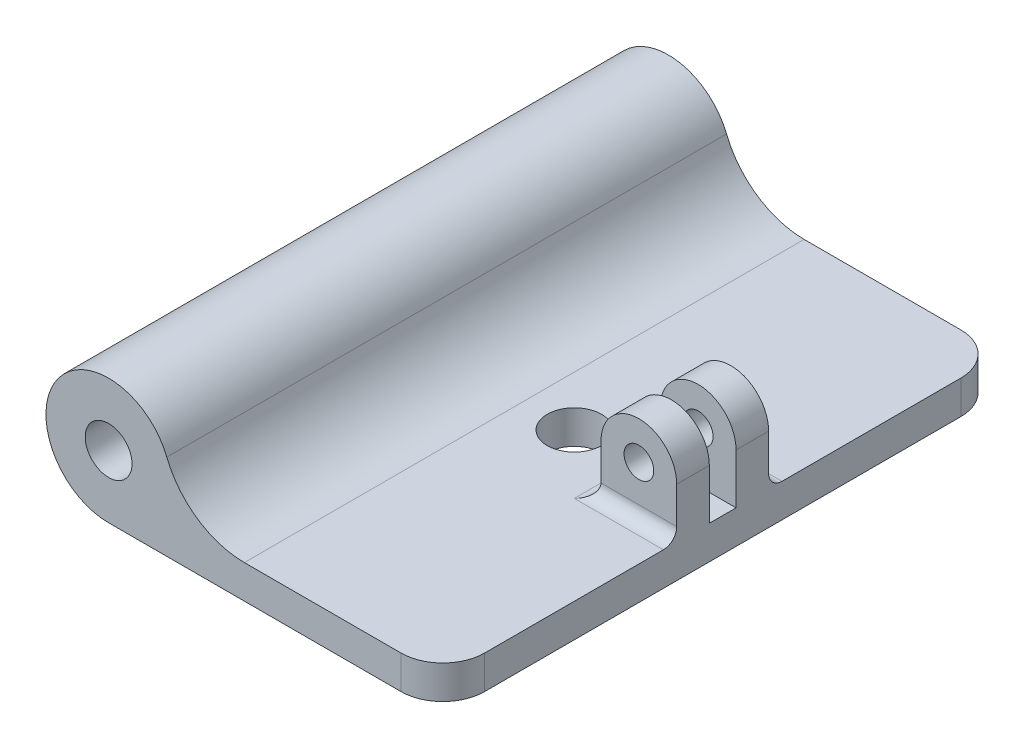
ISO-10303-21;
HEADER;
FILE_DESCRIPTION(('STEP AP214'),'2;1');
FILE_NAME('part.step','',(''),(''),'','','');
FILE_SCHEMA(('AUTOMOTIVE_DESIGN { 1 0 10303 214 1 1 1 1 }'));
ENDSEC;
DATA;
#1=APPLICATION_CONTEXT('core data for automotive mechanical design processes');
#2=APPLICATION_PROTOCOL_DEFINITION('international standard','automotive_design',2000,#1);
#3=PRODUCT_CONTEXT('',#1,'mechanical');
#4=PRODUCT('Part','Part','',(#3));
#5=PRODUCT_RELATED_PRODUCT_CATEGORY('part','',(#4));
#6=PRODUCT_DEFINITION_FORMATION('','',#4);
#7=PRODUCT_DEFINITION_CONTEXT('part definition',#1,'design');
#8=PRODUCT_DEFINITION('design','',#6,#7);
#9=PRODUCT_DEFINITION_SHAPE('','',#8);
#10=(LENGTH_UNIT() NAMED_UNIT(*) SI_UNIT(.MILLI.,.METRE.));
#11=(NAMED_UNIT(*) PLANE_ANGLE_UNIT() SI_UNIT($,.RADIAN.));
#12=(NAMED_UNIT(*) SI_UNIT($,.STERADIAN.) SOLID_ANGLE_UNIT());
#13=UNCERTAINTY_MEASURE_WITH_UNIT(LENGTH_MEASURE(1.E-05),#10,'distance_accuracy_value','');
#14=(GEOMETRIC_REPRESENTATION_CONTEXT(3) GLOBAL_UNCERTAINTY_ASSIGNED_CONTEXT((#13)) GLOBAL_UNIT_ASSIGNED_CONTEXT((#10,
#11,#12)) REPRESENTATION_CONTEXT('',''));
#15=CARTESIAN_POINT('',(0.,0.,0.));
#16=DIRECTION('',(0.,0.,1.));
#17=DIRECTION('',(1.,0.,0.));
#18=AXIS2_PLACEMENT_3D('',#15,#16,#17);
#19=CARTESIAN_POINT('',(40.,-3.5,67.));
#20=DIRECTION('',(-1.,0.,0.));
#21=DIRECTION('',(0.,-1.,0.));
#22=AXIS2_PLACEMENT_3D('',#19,#20,#21);
#23=PLANE('',#22);
#24=DIRECTION('',(0.,0.,-1.));
#25=VECTOR('',#24,1.);
#26=CARTESIAN_POINT('',(40.,-7.5,67.));
#27=LINE('',#26,#25);
#28=CARTESIAN_POINT('',(40.,-7.5,62.));
#29=VERTEX_POINT('',#28);
#30=CARTESIAN_POINT('',(40.,-7.5,5.));
#31=VERTEX_POINT('',#30);
#32=EDGE_CURVE('E235',#29,#31,#27,.T.);
#33=ORIENTED_EDGE('',*,*,#32,.T.);
#34=DIRECTION('',(0.,1.,0.));
#35=VECTOR('',#34,1.);
#36=CARTESIAN_POINT('',(40.,-3.5,5.));
#37=LINE('',#36,#35);
#38=CARTESIAN_POINT('',(40.,-3.5,5.));
#39=VERTEX_POINT('',#38);
#40=EDGE_CURVE('E278',#31,#39,#37,.T.);
#41=ORIENTED_EDGE('',*,*,#40,.T.);
#42=DIRECTION('',(0.,0.,-1.));
#43=VECTOR('',#42,1.);
#44=CARTESIAN_POINT('',(40.,-3.5,67.));
#45=LINE('',#44,#43);
#46=CARTESIAN_POINT('',(40.,-3.5,26.4));
#47=VERTEX_POINT('',#46);
#48=EDGE_CURVE('E232',#47,#39,#45,.T.);
#49=ORIENTED_EDGE('',*,*,#48,.F.);
#50=CARTESIAN_POINT('',(40.,-1.9,26.4));
#51=DIRECTION('',(-1.,0.,0.));
#52=DIRECTION('',(0.,-1.,0.));
#53=AXIS2_PLACEMENT_3D('',#50,#51,#52);
#54=CIRCLE('',#53,1.6);
#55=CARTESIAN_POINT('',(40.,-1.9,28.));
#56=VERTEX_POINT('',#55);
#57=EDGE_CURVE('E261',#47,#56,#54,.T.);
#58=ORIENTED_EDGE('',*,*,#57,.T.);
#59=DIRECTION('',(0.,1.,0.));
#60=VECTOR('',#59,1.);
#61=CARTESIAN_POINT('',(40.,0.,28.));
#62=LINE('',#61,#60);
#63=CARTESIAN_POINT('',(40.,2.5,28.));
#64=VERTEX_POINT('',#63);
#65=EDGE_CURVE('E190',#56,#64,#62,.T.);
#66=ORIENTED_EDGE('',*,*,#65,.T.);
#67=DIRECTION('',(0.,0.,-1.));
#68=VECTOR('',#67,1.);
#69=CARTESIAN_POINT('',(40.,2.5,39.));
#70=LINE('',#69,#68);
#71=CARTESIAN_POINT('',(40.,2.5,31.9));
#72=VERTEX_POINT('',#71);
#73=EDGE_CURVE('E182',#72,#64,#70,.T.);
#74=ORIENTED_EDGE('',*,*,#73,.F.);
#75=DIRECTION('',(0.,1.,0.));
#76=VECTOR('',#75,1.);
#77=CARTESIAN_POINT('',(40.,0.,31.9));
#78=LINE('',#77,#76);
#79=CARTESIAN_POINT('',(40.,-3.5,31.9));
#80=VERTEX_POINT('',#79);
#81=EDGE_CURVE('E165',#80,#72,#78,.T.);
#82=ORIENTED_EDGE('',*,*,#81,.F.);
#83=DIRECTION('',(0.,0.,1.));
#84=VECTOR('',#83,1.);
#85=CARTESIAN_POINT('',(40.,-3.5,31.9));
#86=LINE('',#85,#84);
#87=CARTESIAN_POINT('',(40.,-3.5,35.1));
#88=VERTEX_POINT('',#87);
#89=EDGE_CURVE('E378',#80,#88,#86,.T.);
#90=ORIENTED_EDGE('',*,*,#89,.T.);
#91=DIRECTION('',(0.,1.,0.));
#92=VECTOR('',#91,1.);
#93=CARTESIAN_POINT('',(40.,0.,35.1));
#94=LINE('',#93,#92);
#95=CARTESIAN_POINT('',(40.,2.5,35.1));
#96=VERTEX_POINT('',#95);
#97=EDGE_CURVE('E393',#88,#96,#94,.T.);
#98=ORIENTED_EDGE('',*,*,#97,.T.);
#99=CARTESIAN_POINT('',(40.,2.5,39.));
#100=VERTEX_POINT('',#99);
#101=EDGE_CURVE('E191',#100,#96,#70,.T.);
#102=ORIENTED_EDGE('',*,*,#101,.F.);
#103=DIRECTION('',(0.,1.,0.));
#104=VECTOR('',#103,1.);
#105=CARTESIAN_POINT('',(40.,0.,39.));
#106=LINE('',#105,#104);
#107=CARTESIAN_POINT('',(40.,-1.9,39.));
#108=VERTEX_POINT('',#107);
#109=EDGE_CURVE('E359',#108,#100,#106,.T.);
#110=ORIENTED_EDGE('',*,*,#109,.F.);
#111=CARTESIAN_POINT('',(40.,-1.9,40.6));
#112=DIRECTION('',(-1.,0.,0.));
#113=DIRECTION('',(0.,-1.,0.));
#114=AXIS2_PLACEMENT_3D('',#111,#112,#113);
#115=CIRCLE('',#114,1.6);
#116=CARTESIAN_POINT('',(40.,-3.5,40.6));
#117=VERTEX_POINT('',#116);
#118=EDGE_CURVE('E267',#108,#117,#115,.T.);
#119=ORIENTED_EDGE('',*,*,#118,.T.);
#120=CARTESIAN_POINT('',(40.,-3.5,62.));
#121=VERTEX_POINT('',#120);
#122=EDGE_CURVE('E233',#121,#117,#45,.T.);
#123=ORIENTED_EDGE('',*,*,#122,.F.);
#124=DIRECTION('',(0.,1.,0.));
#125=VECTOR('',#124,1.);
#126=CARTESIAN_POINT('',(40.,-7.5,62.));
#127=LINE('',#126,#125);
#128=EDGE_CURVE('E270',#121,#29,#127,.F.);
#129=ORIENTED_EDGE('',*,*,#128,.T.);
#130=EDGE_LOOP('',(#33,#41,#49,#58,#66,#74,#82,#90,#98,#102,#110,#119,#123,#129));
#131=FACE_BOUND('',#130,.T.);
#132=ADVANCED_FACE('F35',(#131),#23,.F.);
#133=CARTESIAN_POINT('',(35.47,2.5,39.));
#134=DIRECTION('',(0.,0.,-1.));
#135=DIRECTION('',(-1.,0.,0.));
#136=AXIS2_PLACEMENT_3D('',#133,#134,#135);
#137=CYLINDRICAL_SURFACE('',#136,4.53);
#138=CARTESIAN_POINT('',(35.47,2.5,31.9));
#139=DIRECTION('',(0.,0.,1.));
#140=DIRECTION('',(1.,0.,0.));
#141=AXIS2_PLACEMENT_3D('',#138,#139,#140);
#142=CIRCLE('',#141,4.53);
#143=CARTESIAN_POINT('',(30.94,2.5,31.9));
#144=VERTEX_POINT('',#143);
#145=EDGE_CURVE('E169',#72,#144,#142,.T.);
#146=ORIENTED_EDGE('',*,*,#145,.F.);
#147=ORIENTED_EDGE('',*,*,#73,.T.);
#148=CARTESIAN_POINT('',(35.47,2.5,28.));
#149=DIRECTION('',(0.,0.,1.));
#150=DIRECTION('',(1.,0.,0.));
#151=AXIS2_PLACEMENT_3D('',#148,#149,#150);
#152=CIRCLE('',#151,4.53);
#153=CARTESIAN_POINT('',(30.94,2.5,28.));
#154=VERTEX_POINT('',#153);
#155=EDGE_CURVE('E380',#64,#154,#152,.T.);
#156=ORIENTED_EDGE('',*,*,#155,.T.);
#157=DIRECTION('',(0.,0.,-1.));
#158=VECTOR('',#157,1.);
#159=CARTESIAN_POINT('',(30.94,2.5,39.));
#160=LINE('',#159,#158);
#161=EDGE_CURVE('E185',#144,#154,#160,.T.);
#162=ORIENTED_EDGE('',*,*,#161,.F.);
#163=EDGE_LOOP('',(#146,#147,#156,#162));
#164=FACE_BOUND('',#163,.T.);
#165=ADVANCED_FACE('F180',(#164),#137,.T.);
#166=CARTESIAN_POINT('',(30.94,0.,39.));
#167=DIRECTION('',(-1.,0.,0.));
#168=DIRECTION('',(0.,0.,1.));
#169=AXIS2_PLACEMENT_3D('',#166,#167,#168);
#170=PLANE('',#169);
#171=DIRECTION('',(0.,1.,0.));
#172=VECTOR('',#171,1.);
#173=CARTESIAN_POINT('',(30.94,0.,28.));
#174=LINE('',#173,#172);
#175=CARTESIAN_POINT('',(30.94,-1.9,28.));
#176=VERTEX_POINT('',#175);
#177=EDGE_CURVE('E370',#176,#154,#174,.T.);
#178=ORIENTED_EDGE('',*,*,#177,.F.);
#179=DIRECTION('',(0.,0.,-1.));
#180=VECTOR('',#179,1.);
#181=CARTESIAN_POINT('',(30.94,-1.9,39.));
#182=LINE('',#181,#180);
#183=CARTESIAN_POINT('',(30.94,-1.9,31.9));
#184=VERTEX_POINT('',#183);
#185=EDGE_CURVE('E255',#176,#184,#182,.F.);
#186=ORIENTED_EDGE('',*,*,#185,.T.);
#187=DIRECTION('',(0.,1.,0.));
#188=VECTOR('',#187,1.);
#189=CARTESIAN_POINT('',(30.94,0.,31.9));
#190=LINE('',#189,#188);
#191=EDGE_CURVE('E186',#184,#144,#190,.T.);
#192=ORIENTED_EDGE('',*,*,#191,.T.);
#193=ORIENTED_EDGE('',*,*,#161,.T.);
#194=EDGE_LOOP('',(#178,#186,#192,#193));
#195=FACE_BOUND('',#194,.T.);
#196=ADVANCED_FACE('F321',(#195),#170,.T.);
#197=CARTESIAN_POINT('',(35.47,2.5,39.));
#198=DIRECTION('',(0.,0.,-1.));
#199=DIRECTION('',(-1.,0.,0.));
#200=AXIS2_PLACEMENT_3D('',#197,#198,#199);
#201=CYLINDRICAL_SURFACE('',#200,1.778);
#202=CARTESIAN_POINT('',(35.47,2.5,28.));
#203=DIRECTION('',(0.,0.,1.));
#204=DIRECTION('',(1.,0.,0.));
#205=AXIS2_PLACEMENT_3D('',#202,#203,#204);
#206=CIRCLE('',#205,1.778);
#207=CARTESIAN_POINT('',(37.248,2.5,28.));
#208=VERTEX_POINT('',#207);
#209=EDGE_CURVE('E375',#208,#208,#206,.T.);
#210=ORIENTED_EDGE('',*,*,#209,.F.);
#211=EDGE_LOOP('',(#210));
#212=FACE_BOUND('',#211,.T.);
#213=CARTESIAN_POINT('',(35.47,2.5,31.9));
#214=DIRECTION('',(0.,0.,1.));
#215=DIRECTION('',(1.,0.,0.));
#216=AXIS2_PLACEMENT_3D('',#213,#214,#215);
#217=CIRCLE('',#216,1.778);
#218=CARTESIAN_POINT('',(37.248,2.5,31.9));
#219=VERTEX_POINT('',#218);
#220=EDGE_CURVE('E176',#219,#219,#217,.T.);
#221=ORIENTED_EDGE('',*,*,#220,.T.);
#222=EDGE_LOOP('',(#221));
#223=FACE_BOUND('',#222,.T.);
#224=ADVANCED_FACE('F425',(#212,#223),#201,.F.);
#225=CARTESIAN_POINT('',(16.2480768092719,6.5,67.));
#226=DIRECTION('',(0.,0.,1.));
#227=DIRECTION('',(1.,0.,0.));
#228=AXIS2_PLACEMENT_3D('',#225,#226,#227);
#229=PLANE('',#228);
#230=DIRECTION('',(1.,0.,0.));
#231=VECTOR('',#230,1.);
#232=CARTESIAN_POINT('',(0.,-7.5,67.));
#233=LINE('',#232,#231);
#234=CARTESIAN_POINT('',(0.,-7.5,67.));
#235=VERTEX_POINT('',#234);
#236=CARTESIAN_POINT('',(35.,-7.5,67.));
#237=VERTEX_POINT('',#236);
#238=EDGE_CURVE('E218',#235,#237,#233,.T.);
#239=ORIENTED_EDGE('',*,*,#238,.T.);
#240=DIRECTION('',(0.,1.,0.));
#241=VECTOR('',#240,1.);
#242=CARTESIAN_POINT('',(35.,-3.50000000000001,67.));
#243=LINE('',#242,#241);
#244=CARTESIAN_POINT('',(35.,-3.5,67.));
#245=VERTEX_POINT('',#244);
#246=EDGE_CURVE('E11',#237,#245,#243,.T.);
#247=ORIENTED_EDGE('',*,*,#246,.T.);
#248=DIRECTION('',(-1.,0.,0.));
#249=VECTOR('',#248,1.);
#250=CARTESIAN_POINT('',(16.2480768092719,-3.5,67.));
#251=LINE('',#250,#249);
#252=CARTESIAN_POINT('',(16.2480768092719,-3.5,67.));
#253=VERTEX_POINT('',#252);
#254=EDGE_CURVE('E220',#245,#253,#251,.T.);
#255=ORIENTED_EDGE('',*,*,#254,.T.);
#256=CARTESIAN_POINT('',(16.2480768092719,6.5,67.));
#257=DIRECTION('',(0.,0.,-1.));
#258=DIRECTION('',(1.,0.,0.));
#259=AXIS2_PLACEMENT_3D('',#256,#257,#258);
#260=CIRCLE('',#259,10.);
#261=CARTESIAN_POINT('',(6.96346148968797,2.78571428571429,67.));
#262=VERTEX_POINT('',#261);
#263=EDGE_CURVE('E212',#253,#262,#260,.T.);
#264=ORIENTED_EDGE('',*,*,#263,.T.);
#265=CARTESIAN_POINT('',(0.,0.,67.));
#266=DIRECTION('',(0.,0.,1.));
#267=DIRECTION('',(1.,0.,0.));
#268=AXIS2_PLACEMENT_3D('',#265,#266,#267);
#269=CIRCLE('',#268,7.5);
#270=EDGE_CURVE('E215',#262,#235,#269,.T.);
#271=ORIENTED_EDGE('',*,*,#270,.T.);
#272=EDGE_LOOP('',(#239,#247,#255,#264,#271));
#273=FACE_BOUND('',#272,.T.);
#274=CARTESIAN_POINT('',(0.,0.,67.));
#275=DIRECTION('',(0.,0.,1.));
#276=DIRECTION('',(1.,0.,0.));
#277=AXIS2_PLACEMENT_3D('',#274,#275,#276);
#278=CIRCLE('',#277,2.8);
#279=CARTESIAN_POINT('',(2.8,0.,67.));
#280=VERTEX_POINT('',#279);
#281=EDGE_CURVE('E206',#280,#280,#278,.T.);
#282=ORIENTED_EDGE('',*,*,#281,.F.);
#283=EDGE_LOOP('',(#282));
#284=FACE_BOUND('',#283,.T.);
#285=ADVANCED_FACE('F307',(#273,#284),#229,.T.);
#286=CARTESIAN_POINT('',(16.2480768092719,6.5,0.));
#287=DIRECTION('',(0.,0.,1.));
#288=DIRECTION('',(1.,0.,0.));
#289=AXIS2_PLACEMENT_3D('',#286,#287,#288);
#290=PLANE('',#289);
#291=DIRECTION('',(-1.,0.,0.));
#292=VECTOR('',#291,1.);
#293=CARTESIAN_POINT('',(16.2480768092719,-3.5,0.));
#294=LINE('',#293,#292);
#295=CARTESIAN_POINT('',(35.,-3.5,0.));
#296=VERTEX_POINT('',#295);
#297=CARTESIAN_POINT('',(16.2480768092719,-3.5,0.));
#298=VERTEX_POINT('',#297);
#299=EDGE_CURVE('E216',#296,#298,#294,.T.);
#300=ORIENTED_EDGE('',*,*,#299,.F.);
#301=DIRECTION('',(0.,1.,0.));
#302=VECTOR('',#301,1.);
#303=CARTESIAN_POINT('',(35.,6.50000000000003,0.));
#304=LINE('',#303,#302);
#305=CARTESIAN_POINT('',(35.,-7.5,0.));
#306=VERTEX_POINT('',#305);
#307=EDGE_CURVE('E58',#296,#306,#304,.F.);
#308=ORIENTED_EDGE('',*,*,#307,.T.);
#309=DIRECTION('',(1.,0.,0.));
#310=VECTOR('',#309,1.);
#311=CARTESIAN_POINT('',(0.,-7.5,0.));
#312=LINE('',#311,#310);
#313=CARTESIAN_POINT('',(0.,-7.5,0.));
#314=VERTEX_POINT('',#313);
#315=EDGE_CURVE('E227',#314,#306,#312,.T.);
#316=ORIENTED_EDGE('',*,*,#315,.F.);
#317=CARTESIAN_POINT('',(0.,0.,0.));
#318=DIRECTION('',(0.,0.,1.));
#319=DIRECTION('',(1.,0.,0.));
#320=AXIS2_PLACEMENT_3D('',#317,#318,#319);
#321=CIRCLE('',#320,7.5);
#322=CARTESIAN_POINT('',(6.96346148968797,2.78571428571429,0.));
#323=VERTEX_POINT('',#322);
#324=EDGE_CURVE('E225',#323,#314,#321,.T.);
#325=ORIENTED_EDGE('',*,*,#324,.F.);
#326=CARTESIAN_POINT('',(16.2480768092719,6.5,0.));
#327=DIRECTION('',(0.,0.,-1.));
#328=DIRECTION('',(1.,0.,0.));
#329=AXIS2_PLACEMENT_3D('',#326,#327,#328);
#330=CIRCLE('',#329,10.);
#331=EDGE_CURVE('E209',#298,#323,#330,.T.);
#332=ORIENTED_EDGE('',*,*,#331,.F.);
#333=EDGE_LOOP('',(#300,#308,#316,#325,#332));
#334=FACE_BOUND('',#333,.T.);
#335=CARTESIAN_POINT('',(0.,0.,0.));
#336=DIRECTION('',(0.,0.,1.));
#337=DIRECTION('',(1.,0.,0.));
#338=AXIS2_PLACEMENT_3D('',#335,#336,#337);
#339=CIRCLE('',#338,2.8);
#340=CARTESIAN_POINT('',(2.8,0.,0.));
#341=VERTEX_POINT('',#340);
#342=EDGE_CURVE('E205',#341,#341,#339,.T.);
#343=ORIENTED_EDGE('',*,*,#342,.T.);
#344=EDGE_LOOP('',(#343));
#345=FACE_BOUND('',#344,.T.);
#346=ADVANCED_FACE('F299',(#334,#345),#290,.F.);
#347=CARTESIAN_POINT('',(16.2480768092719,6.5,67.));
#348=DIRECTION('',(0.,0.,-1.));
#349=DIRECTION('',(-1.,0.,0.));
#350=AXIS2_PLACEMENT_3D('',#347,#348,#349);
#351=CYLINDRICAL_SURFACE('',#350,10.);
#352=ORIENTED_EDGE('',*,*,#331,.T.);
#353=DIRECTION('',(0.,0.,-1.));
#354=VECTOR('',#353,1.);
#355=CARTESIAN_POINT('',(6.96346148968797,2.78571428571429,67.));
#356=LINE('',#355,#354);
#357=EDGE_CURVE('E240',#262,#323,#356,.T.);
#358=ORIENTED_EDGE('',*,*,#357,.F.);
#359=ORIENTED_EDGE('',*,*,#263,.F.);
#360=DIRECTION('',(0.,0.,-1.));
#361=VECTOR('',#360,1.);
#362=CARTESIAN_POINT('',(16.2480768092719,-3.5,67.));
#363=LINE('',#362,#361);
#364=EDGE_CURVE('E222',#253,#298,#363,.T.);
#365=ORIENTED_EDGE('',*,*,#364,.T.);
#366=EDGE_LOOP('',(#352,#358,#359,#365));
#367=FACE_BOUND('',#366,.T.);
#368=ADVANCED_FACE('F303',(#367),#351,.F.);
#369=CARTESIAN_POINT('',(0.,0.,67.));
#370=DIRECTION('',(0.,0.,-1.));
#371=DIRECTION('',(-1.,0.,0.));
#372=AXIS2_PLACEMENT_3D('',#369,#370,#371);
#373=CYLINDRICAL_SURFACE('',#372,7.5);
#374=ORIENTED_EDGE('',*,*,#324,.T.);
#375=DIRECTION('',(0.,0.,-1.));
#376=VECTOR('',#375,1.);
#377=CARTESIAN_POINT('',(0.,-7.5,67.));
#378=LINE('',#377,#376);
#379=EDGE_CURVE('E237',#235,#314,#378,.T.);
#380=ORIENTED_EDGE('',*,*,#379,.F.);
#381=ORIENTED_EDGE('',*,*,#270,.F.);
#382=ORIENTED_EDGE('',*,*,#357,.T.);
#383=EDGE_LOOP('',(#374,#380,#381,#382));
#384=FACE_BOUND('',#383,.T.);
#385=ADVANCED_FACE('F329',(#384),#373,.T.);
#386=CARTESIAN_POINT('',(0.,-7.5,67.));
#387=DIRECTION('',(0.,1.,0.));
#388=DIRECTION('',(0.,0.,1.));
#389=AXIS2_PLACEMENT_3D('',#386,#387,#388);
#390=PLANE('',#389);
#391=CARTESIAN_POINT('',(22.2480768092719,-7.50000000000001,33.5));
#392=DIRECTION('',(0.,1.,0.));
#393=DIRECTION('',(0.,0.,1.));
#394=AXIS2_PLACEMENT_3D('',#391,#392,#393);
#395=CIRCLE('',#394,3.25);
#396=CARTESIAN_POINT('',(22.2480768092719,-7.50000000000001,36.75));
#397=VERTEX_POINT('',#396);
#398=EDGE_CURVE('E202',#397,#397,#395,.T.);
#399=ORIENTED_EDGE('',*,*,#398,.T.);
#400=EDGE_LOOP('',(#399));
#401=FACE_BOUND('',#400,.T.);
#402=ORIENTED_EDGE('',*,*,#315,.T.);
#403=CARTESIAN_POINT('',(35.,-7.5,5.));
#404=DIRECTION('',(0.,1.,0.));
#405=DIRECTION('',(0.,0.,1.));
#406=AXIS2_PLACEMENT_3D('',#403,#404,#405);
#407=CIRCLE('',#406,5.);
#408=EDGE_CURVE('E43',#306,#31,#407,.F.);
#409=ORIENTED_EDGE('',*,*,#408,.T.);
#410=ORIENTED_EDGE('',*,*,#32,.F.);
#411=CARTESIAN_POINT('',(35.,-7.5,62.));
#412=DIRECTION('',(0.,1.,0.));
#413=DIRECTION('',(0.,0.,1.));
#414=AXIS2_PLACEMENT_3D('',#411,#412,#413);
#415=CIRCLE('',#414,5.);
#416=EDGE_CURVE('E50',#29,#237,#415,.F.);
#417=ORIENTED_EDGE('',*,*,#416,.T.);
#418=ORIENTED_EDGE('',*,*,#238,.F.);
#419=ORIENTED_EDGE('',*,*,#379,.T.);
#420=EDGE_LOOP('',(#402,#409,#410,#417,#418,#419));
#421=FACE_BOUND('',#420,.T.);
#422=ADVANCED_FACE('F287',(#401,#421),#390,.F.);
#423=CARTESIAN_POINT('',(16.2480768092719,-3.5,67.));
#424=DIRECTION('',(0.,-1.,0.));
#425=DIRECTION('',(0.,0.,-1.));
#426=AXIS2_PLACEMENT_3D('',#423,#424,#425);
#427=PLANE('',#426);
#428=CARTESIAN_POINT('',(22.2480768092719,-3.5,33.5));
#429=DIRECTION('',(0.,1.,0.));
#430=DIRECTION('',(0.,0.,1.));
#431=AXIS2_PLACEMENT_3D('',#428,#429,#430);
#432=CIRCLE('',#431,3.25);
#433=CARTESIAN_POINT('',(22.2480768092719,-3.5,36.75));
#434=VERTEX_POINT('',#433);
#435=EDGE_CURVE('E195',#434,#434,#432,.T.);
#436=ORIENTED_EDGE('',*,*,#435,.F.);
#437=EDGE_LOOP('',(#436));
#438=FACE_BOUND('',#437,.T.);
#439=ORIENTED_EDGE('',*,*,#48,.T.);
#440=CARTESIAN_POINT('',(35.,-3.5,5.));
#441=DIRECTION('',(0.,-1.,0.));
#442=DIRECTION('',(0.,0.,-1.));
#443=AXIS2_PLACEMENT_3D('',#440,#441,#442);
#444=CIRCLE('',#443,5.);
#445=EDGE_CURVE('E283',#39,#296,#444,.F.);
#446=ORIENTED_EDGE('',*,*,#445,.T.);
#447=ORIENTED_EDGE('',*,*,#299,.T.);
#448=ORIENTED_EDGE('',*,*,#364,.F.);
#449=ORIENTED_EDGE('',*,*,#254,.F.);
#450=CARTESIAN_POINT('',(35.,-3.5,62.));
#451=DIRECTION('',(0.,-1.,0.));
#452=DIRECTION('',(0.,0.,-1.));
#453=AXIS2_PLACEMENT_3D('',#450,#451,#452);
#454=CIRCLE('',#453,5.);
#455=EDGE_CURVE('E281',#245,#121,#454,.F.);
#456=ORIENTED_EDGE('',*,*,#455,.T.);
#457=ORIENTED_EDGE('',*,*,#122,.T.);
#458=DIRECTION('',(-1.,0.,0.));
#459=VECTOR('',#458,1.);
#460=CARTESIAN_POINT('',(16.2480768092719,-3.5,40.6));
#461=LINE('',#460,#459);
#462=CARTESIAN_POINT('',(29.34,-3.5,40.6));
#463=VERTEX_POINT('',#462);
#464=EDGE_CURVE('E246',#117,#463,#461,.T.);
#465=ORIENTED_EDGE('',*,*,#464,.T.);
#466=DIRECTION('',(0.,0.,-1.));
#467=VECTOR('',#466,1.);
#468=CARTESIAN_POINT('',(29.34,-3.5,67.));
#469=LINE('',#468,#467);
#470=CARTESIAN_POINT('',(29.34,-3.5,35.1));
#471=VERTEX_POINT('',#470);
#472=EDGE_CURVE('E248',#463,#471,#469,.T.);
#473=ORIENTED_EDGE('',*,*,#472,.T.);
#474=DIRECTION('',(-1.,0.,0.));
#475=VECTOR('',#474,1.);
#476=CARTESIAN_POINT('',(0.,-3.50000000000001,35.1));
#477=LINE('',#476,#475);
#478=EDGE_CURVE('E400',#88,#471,#477,.T.);
#479=ORIENTED_EDGE('',*,*,#478,.F.);
#480=ORIENTED_EDGE('',*,*,#89,.F.);
#481=DIRECTION('',(-1.,0.,0.));
#482=VECTOR('',#481,1.);
#483=CARTESIAN_POINT('',(0.,-3.50000000000001,31.9));
#484=LINE('',#483,#482);
#485=CARTESIAN_POINT('',(29.34,-3.5,31.9));
#486=VERTEX_POINT('',#485);
#487=EDGE_CURVE('E172',#80,#486,#484,.T.);
#488=ORIENTED_EDGE('',*,*,#487,.T.);
#489=DIRECTION('',(0.,0.,-1.));
#490=VECTOR('',#489,1.);
#491=CARTESIAN_POINT('',(29.34,-3.5,67.));
#492=LINE('',#491,#490);
#493=CARTESIAN_POINT('',(29.34,-3.5,26.4));
#494=VERTEX_POINT('',#493);
#495=EDGE_CURVE('E251',#486,#494,#492,.T.);
#496=ORIENTED_EDGE('',*,*,#495,.T.);
#497=DIRECTION('',(-1.,0.,0.));
#498=VECTOR('',#497,1.);
#499=CARTESIAN_POINT('',(40.,-3.5,26.4));
#500=LINE('',#499,#498);
#501=EDGE_CURVE('E253',#494,#47,#500,.F.);
#502=ORIENTED_EDGE('',*,*,#501,.T.);
#503=EDGE_LOOP('',(#439,#446,#447,#448,#449,#456,#457,#465,#473,#479,#480,#488,#496,#502));
#504=FACE_BOUND('',#503,.T.);
#505=ADVANCED_FACE('F296',(#438,#504),#427,.F.);
#506=CARTESIAN_POINT('',(0.,0.,67.));
#507=DIRECTION('',(0.,0.,-1.));
#508=DIRECTION('',(-1.,0.,0.));
#509=AXIS2_PLACEMENT_3D('',#506,#507,#508);
#510=CYLINDRICAL_SURFACE('',#509,2.8);
#511=ORIENTED_EDGE('',*,*,#281,.T.);
#512=EDGE_LOOP('',(#511));
#513=FACE_BOUND('',#512,.T.);
#514=ORIENTED_EDGE('',*,*,#342,.F.);
#515=EDGE_LOOP('',(#514));
#516=FACE_BOUND('',#515,.T.);
#517=ADVANCED_FACE('F436',(#513,#516),#510,.F.);
#518=CARTESIAN_POINT('',(22.2480768092719,-103.5,33.5));
#519=DIRECTION('',(0.,1.,0.));
#520=DIRECTION('',(0.,0.,1.));
#521=AXIS2_PLACEMENT_3D('',#518,#519,#520);
#522=CYLINDRICAL_SURFACE('',#521,3.25);
#523=ORIENTED_EDGE('',*,*,#435,.T.);
#524=EDGE_LOOP('',(#523));
#525=FACE_BOUND('',#524,.T.);
#526=ORIENTED_EDGE('',*,*,#398,.F.);
#527=EDGE_LOOP('',(#526));
#528=FACE_BOUND('',#527,.T.);
#529=ADVANCED_FACE('F432',(#525,#528),#522,.F.);
#530=ORIENTED_EDGE('',*,*,#101,.T.);
#531=CARTESIAN_POINT('',(35.47,2.5,35.1));
#532=DIRECTION('',(0.,0.,1.));
#533=DIRECTION('',(1.,0.,0.));
#534=AXIS2_PLACEMENT_3D('',#531,#532,#533);
#535=CIRCLE('',#534,4.53);
#536=CARTESIAN_POINT('',(30.94,2.5,35.1));
#537=VERTEX_POINT('',#536);
#538=EDGE_CURVE('E395',#96,#537,#535,.T.);
#539=ORIENTED_EDGE('',*,*,#538,.T.);
#540=CARTESIAN_POINT('',(30.94,2.5,39.));
#541=VERTEX_POINT('',#540);
#542=EDGE_CURVE('E192',#541,#537,#160,.T.);
#543=ORIENTED_EDGE('',*,*,#542,.F.);
#544=CARTESIAN_POINT('',(35.47,2.5,39.));
#545=DIRECTION('',(0.,0.,1.));
#546=DIRECTION('',(1.,0.,0.));
#547=AXIS2_PLACEMENT_3D('',#544,#545,#546);
#548=CIRCLE('',#547,4.53);
#549=EDGE_CURVE('E364',#100,#541,#548,.T.);
#550=ORIENTED_EDGE('',*,*,#549,.F.);
#551=EDGE_LOOP('',(#530,#539,#543,#550));
#552=FACE_BOUND('',#551,.T.);
#553=ADVANCED_FACE('F323',(#552),#137,.T.);
#554=DIRECTION('',(0.,1.,0.));
#555=VECTOR('',#554,1.);
#556=CARTESIAN_POINT('',(30.94,0.,35.1));
#557=LINE('',#556,#555);
#558=CARTESIAN_POINT('',(30.94,-1.9,35.1));
#559=VERTEX_POINT('',#558);
#560=EDGE_CURVE('E398',#559,#537,#557,.T.);
#561=ORIENTED_EDGE('',*,*,#560,.F.);
#562=DIRECTION('',(0.,0.,-1.));
#563=VECTOR('',#562,1.);
#564=CARTESIAN_POINT('',(30.94,-1.9,39.));
#565=LINE('',#564,#563);
#566=CARTESIAN_POINT('',(30.94,-1.9,39.));
#567=VERTEX_POINT('',#566);
#568=EDGE_CURVE('E257',#559,#567,#565,.F.);
#569=ORIENTED_EDGE('',*,*,#568,.T.);
#570=DIRECTION('',(0.,1.,0.));
#571=VECTOR('',#570,1.);
#572=CARTESIAN_POINT('',(30.94,0.,39.));
#573=LINE('',#572,#571);
#574=EDGE_CURVE('E367',#567,#541,#573,.T.);
#575=ORIENTED_EDGE('',*,*,#574,.T.);
#576=ORIENTED_EDGE('',*,*,#542,.T.);
#577=EDGE_LOOP('',(#561,#569,#575,#576));
#578=FACE_BOUND('',#577,.T.);
#579=ADVANCED_FACE('F409',(#578),#170,.T.);
#580=CARTESIAN_POINT('',(35.47,2.5,35.1));
#581=DIRECTION('',(0.,0.,1.));
#582=DIRECTION('',(1.,0.,0.));
#583=AXIS2_PLACEMENT_3D('',#580,#581,#582);
#584=CIRCLE('',#583,1.778);
#585=CARTESIAN_POINT('',(37.248,2.5,35.1));
#586=VERTEX_POINT('',#585);
#587=EDGE_CURVE('E273',#586,#586,#584,.T.);
#588=ORIENTED_EDGE('',*,*,#587,.F.);
#589=EDGE_LOOP('',(#588));
#590=FACE_BOUND('',#589,.T.);
#591=CARTESIAN_POINT('',(35.47,2.5,39.));
#592=DIRECTION('',(0.,0.,1.));
#593=DIRECTION('',(1.,0.,0.));
#594=AXIS2_PLACEMENT_3D('',#591,#592,#593);
#595=CIRCLE('',#594,1.778);
#596=CARTESIAN_POINT('',(37.248,2.5,39.));
#597=VERTEX_POINT('',#596);
#598=EDGE_CURVE('E365',#597,#597,#595,.T.);
#599=ORIENTED_EDGE('',*,*,#598,.T.);
#600=EDGE_LOOP('',(#599));
#601=FACE_BOUND('',#600,.T.);
#602=ADVANCED_FACE('F414',(#590,#601),#201,.F.);
#603=CARTESIAN_POINT('',(0.,0.,39.));
#604=DIRECTION('',(0.,0.,1.));
#605=DIRECTION('',(1.,0.,0.));
#606=AXIS2_PLACEMENT_3D('',#603,#604,#605);
#607=PLANE('',#606);
#608=ORIENTED_EDGE('',*,*,#598,.F.);
#609=EDGE_LOOP('',(#608));
#610=FACE_BOUND('',#609,.T.);
#611=ORIENTED_EDGE('',*,*,#574,.F.);
#612=DIRECTION('',(-1.,0.,0.));
#613=VECTOR('',#612,1.);
#614=CARTESIAN_POINT('',(0.,-1.9,39.));
#615=LINE('',#614,#613);
#616=EDGE_CURVE('E259',#567,#108,#615,.F.);
#617=ORIENTED_EDGE('',*,*,#616,.T.);
#618=ORIENTED_EDGE('',*,*,#109,.T.);
#619=ORIENTED_EDGE('',*,*,#549,.T.);
#620=EDGE_LOOP('',(#611,#617,#618,#619));
#621=FACE_BOUND('',#620,.T.);
#622=ADVANCED_FACE('F412',(#610,#621),#607,.T.);
#623=CARTESIAN_POINT('',(0.,0.,28.));
#624=DIRECTION('',(0.,0.,1.));
#625=DIRECTION('',(1.,0.,0.));
#626=AXIS2_PLACEMENT_3D('',#623,#624,#625);
#627=PLANE('',#626);
#628=ORIENTED_EDGE('',*,*,#209,.T.);
#629=EDGE_LOOP('',(#628));
#630=FACE_BOUND('',#629,.T.);
#631=ORIENTED_EDGE('',*,*,#65,.F.);
#632=DIRECTION('',(-1.,0.,0.));
#633=VECTOR('',#632,1.);
#634=CARTESIAN_POINT('',(30.94,-1.9,28.));
#635=LINE('',#634,#633);
#636=EDGE_CURVE('E243',#56,#176,#635,.T.);
#637=ORIENTED_EDGE('',*,*,#636,.T.);
#638=ORIENTED_EDGE('',*,*,#177,.T.);
#639=ORIENTED_EDGE('',*,*,#155,.F.);
#640=EDGE_LOOP('',(#631,#637,#638,#639));
#641=FACE_BOUND('',#640,.T.);
#642=ADVANCED_FACE('F383',(#630,#641),#627,.F.);
#643=CARTESIAN_POINT('',(0.,0.,31.9));
#644=DIRECTION('',(0.,0.,1.));
#645=DIRECTION('',(1.,0.,0.));
#646=AXIS2_PLACEMENT_3D('',#643,#644,#645);
#647=PLANE('',#646);
#648=ORIENTED_EDGE('',*,*,#220,.F.);
#649=EDGE_LOOP('',(#648));
#650=FACE_BOUND('',#649,.T.);
#651=ORIENTED_EDGE('',*,*,#81,.T.);
#652=ORIENTED_EDGE('',*,*,#145,.T.);
#653=ORIENTED_EDGE('',*,*,#191,.F.);
#654=CARTESIAN_POINT('',(29.34,-1.9,31.9));
#655=DIRECTION('',(0.,0.,1.));
#656=DIRECTION('',(1.,0.,0.));
#657=AXIS2_PLACEMENT_3D('',#654,#655,#656);
#658=CIRCLE('',#657,1.6);
#659=EDGE_CURVE('E263',#184,#486,#658,.F.);
#660=ORIENTED_EDGE('',*,*,#659,.T.);
#661=ORIENTED_EDGE('',*,*,#487,.F.);
#662=EDGE_LOOP('',(#651,#652,#653,#660,#661));
#663=FACE_BOUND('',#662,.T.);
#664=ADVANCED_FACE('F167',(#650,#663),#647,.T.);
#665=CARTESIAN_POINT('',(0.,0.,35.1));
#666=DIRECTION('',(0.,0.,1.));
#667=DIRECTION('',(1.,0.,0.));
#668=AXIS2_PLACEMENT_3D('',#665,#666,#667);
#669=PLANE('',#668);
#670=ORIENTED_EDGE('',*,*,#587,.T.);
#671=EDGE_LOOP('',(#670));
#672=FACE_BOUND('',#671,.T.);
#673=ORIENTED_EDGE('',*,*,#97,.F.);
#674=ORIENTED_EDGE('',*,*,#478,.T.);
#675=CARTESIAN_POINT('',(29.34,-1.9,35.1));
#676=DIRECTION('',(0.,0.,1.));
#677=DIRECTION('',(1.,0.,0.));
#678=AXIS2_PLACEMENT_3D('',#675,#676,#677);
#679=CIRCLE('',#678,1.6);
#680=EDGE_CURVE('E265',#471,#559,#679,.T.);
#681=ORIENTED_EDGE('',*,*,#680,.T.);
#682=ORIENTED_EDGE('',*,*,#560,.T.);
#683=ORIENTED_EDGE('',*,*,#538,.F.);
#684=EDGE_LOOP('',(#673,#674,#681,#682,#683));
#685=FACE_BOUND('',#684,.T.);
#686=ADVANCED_FACE('F344',(#672,#685),#669,.F.);
#687=CARTESIAN_POINT('',(29.34,-1.9,67.));
#688=DIRECTION('',(0.,0.,-1.));
#689=DIRECTION('',(-1.,0.,0.));
#690=AXIS2_PLACEMENT_3D('',#687,#688,#689);
#691=CYLINDRICAL_SURFACE('',#690,1.6);
#692=ORIENTED_EDGE('',*,*,#659,.F.);
#693=ORIENTED_EDGE('',*,*,#185,.F.);
#694=CARTESIAN_POINT('',(29.34,-1.9,26.4));
#695=DIRECTION('',(0.707106781186547,0.,-0.707106781186547));
#696=DIRECTION('',(-0.707106781186547,0.,-0.707106781186547));
#697=AXIS2_PLACEMENT_3D('',#694,#695,#696);
#698=ELLIPSE('',#697,2.26274169979695,1.6);
#699=EDGE_CURVE('E271',#494,#176,#698,.F.);
#700=ORIENTED_EDGE('',*,*,#699,.F.);
#701=ORIENTED_EDGE('',*,*,#495,.F.);
#702=EDGE_LOOP('',(#692,#693,#700,#701));
#703=FACE_BOUND('',#702,.T.);
#704=ADVANCED_FACE('F340',(#703),#691,.F.);
#705=CARTESIAN_POINT('',(0.,-1.9,26.4));
#706=DIRECTION('',(1.,0.,0.));
#707=DIRECTION('',(0.,0.,-1.));
#708=AXIS2_PLACEMENT_3D('',#705,#706,#707);
#709=CYLINDRICAL_SURFACE('',#708,1.6);
#710=ORIENTED_EDGE('',*,*,#57,.F.);
#711=ORIENTED_EDGE('',*,*,#501,.F.);
#712=ORIENTED_EDGE('',*,*,#699,.T.);
#713=ORIENTED_EDGE('',*,*,#636,.F.);
#714=EDGE_LOOP('',(#710,#711,#712,#713));
#715=FACE_BOUND('',#714,.T.);
#716=ADVANCED_FACE('F336',(#715),#709,.F.);
#717=CARTESIAN_POINT('',(16.2480768092719,-1.9,40.6));
#718=DIRECTION('',(-1.,0.,0.));
#719=DIRECTION('',(0.,0.,1.));
#720=AXIS2_PLACEMENT_3D('',#717,#718,#719);
#721=CYLINDRICAL_SURFACE('',#720,1.6);
#722=ORIENTED_EDGE('',*,*,#118,.F.);
#723=ORIENTED_EDGE('',*,*,#616,.F.);
#724=CARTESIAN_POINT('',(29.34,-1.9,40.6));
#725=DIRECTION('',(-0.707106781186547,0.,-0.707106781186547));
#726=DIRECTION('',(-0.707106781186547,0.,0.707106781186547));
#727=AXIS2_PLACEMENT_3D('',#724,#725,#726);
#728=ELLIPSE('',#727,2.26274169979695,1.6);
#729=EDGE_CURVE('E274',#463,#567,#728,.F.);
#730=ORIENTED_EDGE('',*,*,#729,.F.);
#731=ORIENTED_EDGE('',*,*,#464,.F.);
#732=EDGE_LOOP('',(#722,#723,#730,#731));
#733=FACE_BOUND('',#732,.T.);
#734=ADVANCED_FACE('F339',(#733),#721,.F.);
#735=CARTESIAN_POINT('',(29.34,-1.9,67.));
#736=DIRECTION('',(0.,0.,-1.));
#737=DIRECTION('',(-1.,0.,0.));
#738=AXIS2_PLACEMENT_3D('',#735,#736,#737);
#739=CYLINDRICAL_SURFACE('',#738,1.6);
#740=ORIENTED_EDGE('',*,*,#729,.T.);
#741=ORIENTED_EDGE('',*,*,#568,.F.);
#742=ORIENTED_EDGE('',*,*,#680,.F.);
#743=ORIENTED_EDGE('',*,*,#472,.F.);
#744=EDGE_LOOP('',(#740,#741,#742,#743));
#745=FACE_BOUND('',#744,.T.);
#746=ADVANCED_FACE('F315',(#745),#739,.F.);
#747=CARTESIAN_POINT('',(35.,-3.50000000000001,5.));
#748=DIRECTION('',(0.,1.,0.));
#749=DIRECTION('',(-1.,0.,0.));
#750=AXIS2_PLACEMENT_3D('',#747,#748,#749);
#751=CYLINDRICAL_SURFACE('',#750,5.);
#752=ORIENTED_EDGE('',*,*,#408,.F.);
#753=ORIENTED_EDGE('',*,*,#307,.F.);
#754=ORIENTED_EDGE('',*,*,#445,.F.);
#755=ORIENTED_EDGE('',*,*,#40,.F.);
#756=EDGE_LOOP('',(#752,#753,#754,#755));
#757=FACE_BOUND('',#756,.T.);
#758=ADVANCED_FACE('F294',(#757),#751,.T.);
#759=CARTESIAN_POINT('',(35.,6.50000000000003,62.));
#760=DIRECTION('',(0.,-1.,0.));
#761=DIRECTION('',(1.,0.,0.));
#762=AXIS2_PLACEMENT_3D('',#759,#760,#761);
#763=CYLINDRICAL_SURFACE('',#762,5.);
#764=ORIENTED_EDGE('',*,*,#416,.F.);
#765=ORIENTED_EDGE('',*,*,#128,.F.);
#766=ORIENTED_EDGE('',*,*,#455,.F.);
#767=ORIENTED_EDGE('',*,*,#246,.F.);
#768=EDGE_LOOP('',(#764,#765,#766,#767));
#769=FACE_BOUND('',#768,.T.);
#770=ADVANCED_FACE('F37',(#769),#763,.T.);
#771=CLOSED_SHELL('',(#132,#165,#196,#224,#285,#346,#368,#385,#422,#505,#517,#529,#553,#579,
#602,#622,#642,#664,#686,#704,#716,#734,#746,#758,#770));
#772=MANIFOLD_SOLID_BREP('B2',#771);
#773=ADVANCED_BREP_SHAPE_REPRESENTATION('',(#18,#772),#14);
#774=SHAPE_DEFINITION_REPRESENTATION(#9,#773);
ENDSEC;
END-ISO-10303-21;
